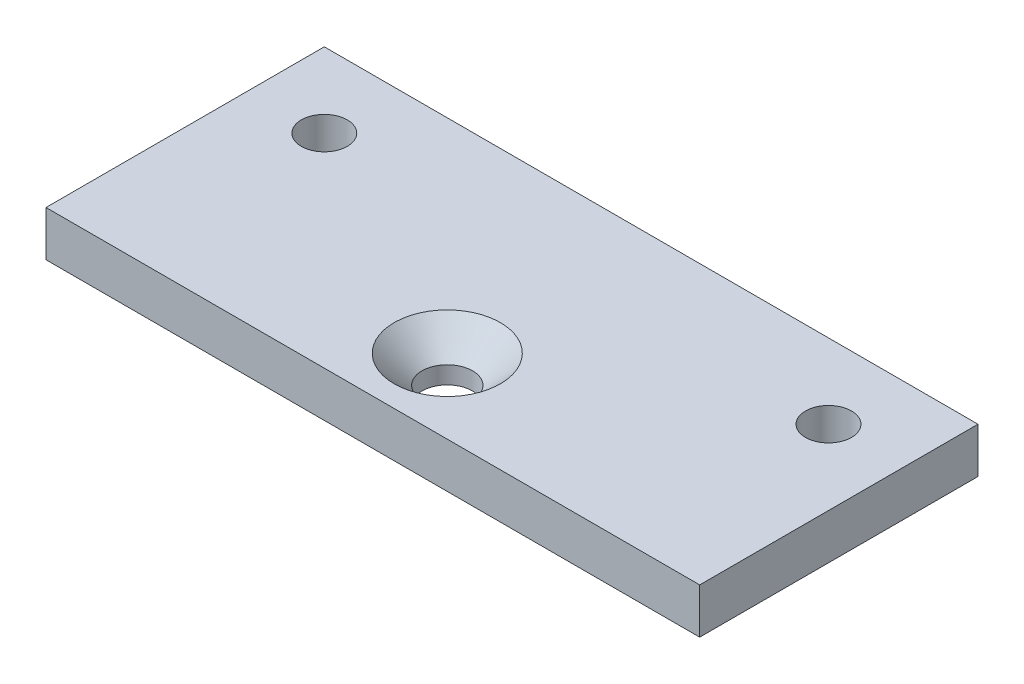
ISO-10303-21;
HEADER;
FILE_DESCRIPTION(('STEP AP214'),'2;1');
FILE_NAME('part.step','',(''),(''),'','','');
FILE_SCHEMA(('AUTOMOTIVE_DESIGN { 1 0 10303 214 1 1 1 1 }'));
ENDSEC;
DATA;
#1=APPLICATION_CONTEXT('core data for automotive mechanical design processes');
#2=APPLICATION_PROTOCOL_DEFINITION('international standard','automotive_design',2000,#1);
#3=PRODUCT_CONTEXT('',#1,'mechanical');
#4=PRODUCT('Part','Part','',(#3));
#5=PRODUCT_RELATED_PRODUCT_CATEGORY('part','',(#4));
#6=PRODUCT_DEFINITION_FORMATION('','',#4);
#7=PRODUCT_DEFINITION_CONTEXT('part definition',#1,'design');
#8=PRODUCT_DEFINITION('design','',#6,#7);
#9=PRODUCT_DEFINITION_SHAPE('','',#8);
#10=(LENGTH_UNIT() NAMED_UNIT(*) SI_UNIT(.MILLI.,.METRE.));
#11=(NAMED_UNIT(*) PLANE_ANGLE_UNIT() SI_UNIT($,.RADIAN.));
#12=(NAMED_UNIT(*) SI_UNIT($,.STERADIAN.) SOLID_ANGLE_UNIT());
#13=UNCERTAINTY_MEASURE_WITH_UNIT(LENGTH_MEASURE(1.E-05),#10,'distance_accuracy_value','');
#14=(GEOMETRIC_REPRESENTATION_CONTEXT(3) GLOBAL_UNCERTAINTY_ASSIGNED_CONTEXT((#13)) GLOBAL_UNIT_ASSIGNED_CONTEXT((#10,
#11,#12)) REPRESENTATION_CONTEXT('',''));
#15=CARTESIAN_POINT('',(0.,0.,0.));
#16=DIRECTION('',(0.,0.,1.));
#17=DIRECTION('',(1.,0.,0.));
#18=AXIS2_PLACEMENT_3D('',#15,#16,#17);
#19=CARTESIAN_POINT('',(0.,0.,-4.25));
#20=DIRECTION('',(0.,0.,1.));
#21=DIRECTION('',(1.,0.,0.));
#22=AXIS2_PLACEMENT_3D('',#19,#20,#21);
#23=PLANE('',#22);
#24=DIRECTION('',(1.,0.,0.));
#25=VECTOR('',#24,1.);
#26=CARTESIAN_POINT('',(0.,3.5,-4.25));
#27=LINE('',#26,#25);
#28=CARTESIAN_POINT('',(-25.25,3.5,-4.25));
#29=VERTEX_POINT('',#28);
#30=CARTESIAN_POINT('',(25.25,3.5,-4.25));
#31=VERTEX_POINT('',#30);
#32=EDGE_CURVE('E71',#29,#31,#27,.T.);
#33=ORIENTED_EDGE('',*,*,#32,.F.);
#34=DIRECTION('',(0.,1.,0.));
#35=VECTOR('',#34,1.);
#36=CARTESIAN_POINT('',(-25.25,3.5,-4.25));
#37=LINE('',#36,#35);
#38=CARTESIAN_POINT('',(-25.25,0.,-4.25));
#39=VERTEX_POINT('',#38);
#40=EDGE_CURVE('E82',#39,#29,#37,.T.);
#41=ORIENTED_EDGE('',*,*,#40,.F.);
#42=DIRECTION('',(1.,0.,0.));
#43=VECTOR('',#42,1.);
#44=CARTESIAN_POINT('',(0.,0.,-4.25));
#45=LINE('',#44,#43);
#46=CARTESIAN_POINT('',(25.25,0.,-4.25));
#47=VERTEX_POINT('',#46);
#48=EDGE_CURVE('E92',#39,#47,#45,.T.);
#49=ORIENTED_EDGE('',*,*,#48,.T.);
#50=DIRECTION('',(0.,1.,0.));
#51=VECTOR('',#50,1.);
#52=CARTESIAN_POINT('',(25.25,3.5,-4.25));
#53=LINE('',#52,#51);
#54=EDGE_CURVE('E93',#47,#31,#53,.T.);
#55=ORIENTED_EDGE('',*,*,#54,.T.);
#56=EDGE_LOOP('',(#33,#41,#49,#55));
#57=FACE_BOUND('',#56,.T.);
#58=ADVANCED_FACE('F34',(#57),#23,.T.);
#59=CARTESIAN_POINT('',(25.25,3.5,0.));
#60=DIRECTION('',(-1.,0.,0.));
#61=DIRECTION('',(0.,0.,1.));
#62=AXIS2_PLACEMENT_3D('',#59,#60,#61);
#63=PLANE('',#62);
#64=ORIENTED_EDGE('',*,*,#54,.F.);
#65=DIRECTION('',(0.,0.,-1.));
#66=VECTOR('',#65,1.);
#67=CARTESIAN_POINT('',(25.25,0.,0.));
#68=LINE('',#67,#66);
#69=CARTESIAN_POINT('',(25.25,0.,-25.75));
#70=VERTEX_POINT('',#69);
#71=EDGE_CURVE('E38',#47,#70,#68,.T.);
#72=ORIENTED_EDGE('',*,*,#71,.T.);
#73=DIRECTION('',(0.,-1.,0.));
#74=VECTOR('',#73,1.);
#75=CARTESIAN_POINT('',(25.25,3.5,-25.75));
#76=LINE('',#75,#74);
#77=CARTESIAN_POINT('',(25.25,3.5,-25.75));
#78=VERTEX_POINT('',#77);
#79=EDGE_CURVE('E121',#78,#70,#76,.T.);
#80=ORIENTED_EDGE('',*,*,#79,.F.);
#81=DIRECTION('',(0.,0.,-1.));
#82=VECTOR('',#81,1.);
#83=CARTESIAN_POINT('',(25.25,3.5,0.));
#84=LINE('',#83,#82);
#85=EDGE_CURVE('E101',#31,#78,#84,.T.);
#86=ORIENTED_EDGE('',*,*,#85,.F.);
#87=EDGE_LOOP('',(#64,#72,#80,#86));
#88=FACE_BOUND('',#87,.T.);
#89=ADVANCED_FACE('F150',(#88),#63,.F.);
#90=CARTESIAN_POINT('',(-25.25,3.5,0.));
#91=DIRECTION('',(-1.,0.,0.));
#92=DIRECTION('',(0.,0.,1.));
#93=AXIS2_PLACEMENT_3D('',#90,#91,#92);
#94=PLANE('',#93);
#95=DIRECTION('',(0.,0.,-1.));
#96=VECTOR('',#95,1.);
#97=CARTESIAN_POINT('',(-25.25,0.,0.));
#98=LINE('',#97,#96);
#99=CARTESIAN_POINT('',(-25.25,0.,-25.75));
#100=VERTEX_POINT('',#99);
#101=EDGE_CURVE('E79',#39,#100,#98,.T.);
#102=ORIENTED_EDGE('',*,*,#101,.F.);
#103=ORIENTED_EDGE('',*,*,#40,.T.);
#104=DIRECTION('',(0.,0.,-1.));
#105=VECTOR('',#104,1.);
#106=CARTESIAN_POINT('',(-25.25,3.5,0.));
#107=LINE('',#106,#105);
#108=CARTESIAN_POINT('',(-25.25,3.5,-25.75));
#109=VERTEX_POINT('',#108);
#110=EDGE_CURVE('E64',#29,#109,#107,.T.);
#111=ORIENTED_EDGE('',*,*,#110,.T.);
#112=DIRECTION('',(0.,-1.,0.));
#113=VECTOR('',#112,1.);
#114=CARTESIAN_POINT('',(-25.25,3.5,-25.75));
#115=LINE('',#114,#113);
#116=EDGE_CURVE('E83',#109,#100,#115,.T.);
#117=ORIENTED_EDGE('',*,*,#116,.T.);
#118=EDGE_LOOP('',(#102,#103,#111,#117));
#119=FACE_BOUND('',#118,.T.);
#120=ADVANCED_FACE('F81',(#119),#94,.T.);
#121=CARTESIAN_POINT('',(0.,3.5,0.));
#122=DIRECTION('',(0.,1.,0.));
#123=DIRECTION('',(0.,0.,1.));
#124=AXIS2_PLACEMENT_3D('',#121,#122,#123);
#125=PLANE('',#124);
#126=CARTESIAN_POINT('',(19.475,3.5,-19.975));
#127=DIRECTION('',(0.,1.,0.));
#128=DIRECTION('',(0.,0.,1.));
#129=AXIS2_PLACEMENT_3D('',#126,#127,#128);
#130=CIRCLE('',#129,1.775);
#131=CARTESIAN_POINT('',(19.475,3.5,-18.2));
#132=VERTEX_POINT('',#131);
#133=EDGE_CURVE('E102',#132,#132,#130,.T.);
#134=ORIENTED_EDGE('',*,*,#133,.F.);
#135=EDGE_LOOP('',(#134));
#136=FACE_BOUND('',#135,.T.);
#137=CARTESIAN_POINT('',(-19.475,3.5,-19.975));
#138=DIRECTION('',(0.,1.,0.));
#139=DIRECTION('',(0.,0.,1.));
#140=AXIS2_PLACEMENT_3D('',#137,#138,#139);
#141=CIRCLE('',#140,1.775);
#142=CARTESIAN_POINT('',(-19.475,3.5,-18.2));
#143=VERTEX_POINT('',#142);
#144=EDGE_CURVE('E89',#143,#143,#141,.T.);
#145=ORIENTED_EDGE('',*,*,#144,.F.);
#146=EDGE_LOOP('',(#145));
#147=FACE_BOUND('',#146,.T.);
#148=CARTESIAN_POINT('',(0.,3.5,-10.));
#149=DIRECTION('',(0.,1.,0.));
#150=DIRECTION('',(0.,0.,1.));
#151=AXIS2_PLACEMENT_3D('',#148,#149,#150);
#152=CIRCLE('',#151,4.1);
#153=CARTESIAN_POINT('',(0.,3.5,-5.9));
#154=VERTEX_POINT('',#153);
#155=EDGE_CURVE('E11',#154,#154,#152,.T.);
#156=ORIENTED_EDGE('',*,*,#155,.F.);
#157=EDGE_LOOP('',(#156));
#158=FACE_BOUND('',#157,.T.);
#159=ORIENTED_EDGE('',*,*,#110,.F.);
#160=ORIENTED_EDGE('',*,*,#32,.T.);
#161=ORIENTED_EDGE('',*,*,#85,.T.);
#162=DIRECTION('',(1.,0.,0.));
#163=VECTOR('',#162,1.);
#164=CARTESIAN_POINT('',(0.,3.5,-25.75));
#165=LINE('',#164,#163);
#166=EDGE_CURVE('E100',#109,#78,#165,.T.);
#167=ORIENTED_EDGE('',*,*,#166,.F.);
#168=EDGE_LOOP('',(#159,#160,#161,#167));
#169=FACE_BOUND('',#168,.T.);
#170=ADVANCED_FACE('F36',(#136,#147,#158,#169),#125,.T.);
#171=CARTESIAN_POINT('',(0.,0.,0.));
#172=DIRECTION('',(0.,1.,0.));
#173=DIRECTION('',(0.,0.,1.));
#174=AXIS2_PLACEMENT_3D('',#171,#172,#173);
#175=PLANE('',#174);
#176=CARTESIAN_POINT('',(19.475,0.,-19.975));
#177=DIRECTION('',(0.,1.,0.));
#178=DIRECTION('',(0.,0.,1.));
#179=AXIS2_PLACEMENT_3D('',#176,#177,#178);
#180=CIRCLE('',#179,1.775);
#181=CARTESIAN_POINT('',(19.475,0.,-18.2));
#182=VERTEX_POINT('',#181);
#183=EDGE_CURVE('E125',#182,#182,#180,.T.);
#184=ORIENTED_EDGE('',*,*,#183,.T.);
#185=EDGE_LOOP('',(#184));
#186=FACE_BOUND('',#185,.T.);
#187=CARTESIAN_POINT('',(-19.475,0.,-19.975));
#188=DIRECTION('',(0.,1.,0.));
#189=DIRECTION('',(0.,0.,1.));
#190=AXIS2_PLACEMENT_3D('',#187,#188,#189);
#191=CIRCLE('',#190,1.775);
#192=CARTESIAN_POINT('',(-19.475,0.,-18.2));
#193=VERTEX_POINT('',#192);
#194=EDGE_CURVE('E111',#193,#193,#191,.T.);
#195=ORIENTED_EDGE('',*,*,#194,.T.);
#196=EDGE_LOOP('',(#195));
#197=FACE_BOUND('',#196,.T.);
#198=CARTESIAN_POINT('',(0.,0.,-10.));
#199=DIRECTION('',(0.,1.,0.));
#200=DIRECTION('',(0.,0.,1.));
#201=AXIS2_PLACEMENT_3D('',#198,#199,#200);
#202=CIRCLE('',#201,1.95);
#203=CARTESIAN_POINT('',(0.,0.,-8.05));
#204=VERTEX_POINT('',#203);
#205=EDGE_CURVE('E116',#204,#204,#202,.T.);
#206=ORIENTED_EDGE('',*,*,#205,.T.);
#207=EDGE_LOOP('',(#206));
#208=FACE_BOUND('',#207,.T.);
#209=ORIENTED_EDGE('',*,*,#48,.F.);
#210=ORIENTED_EDGE('',*,*,#101,.T.);
#211=DIRECTION('',(1.,0.,0.));
#212=VECTOR('',#211,1.);
#213=CARTESIAN_POINT('',(0.,0.,-25.75));
#214=LINE('',#213,#212);
#215=EDGE_CURVE('E88',#100,#70,#214,.T.);
#216=ORIENTED_EDGE('',*,*,#215,.T.);
#217=ORIENTED_EDGE('',*,*,#71,.F.);
#218=EDGE_LOOP('',(#209,#210,#216,#217));
#219=FACE_BOUND('',#218,.T.);
#220=ADVANCED_FACE('F95',(#186,#197,#208,#219),#175,.F.);
#221=CARTESIAN_POINT('',(0.,3.5,-25.75));
#222=DIRECTION('',(0.,0.,-1.));
#223=DIRECTION('',(-1.,0.,0.));
#224=AXIS2_PLACEMENT_3D('',#221,#222,#223);
#225=PLANE('',#224);
#226=ORIENTED_EDGE('',*,*,#215,.F.);
#227=ORIENTED_EDGE('',*,*,#116,.F.);
#228=ORIENTED_EDGE('',*,*,#166,.T.);
#229=ORIENTED_EDGE('',*,*,#79,.T.);
#230=EDGE_LOOP('',(#226,#227,#228,#229));
#231=FACE_BOUND('',#230,.T.);
#232=ADVANCED_FACE('F147',(#231),#225,.T.);
#233=CARTESIAN_POINT('',(19.475,3.5,-19.975));
#234=DIRECTION('',(0.,-1.,0.));
#235=DIRECTION('',(0.,0.,-1.));
#236=AXIS2_PLACEMENT_3D('',#233,#234,#235);
#237=CYLINDRICAL_SURFACE('',#236,1.775);
#238=ORIENTED_EDGE('',*,*,#133,.T.);
#239=EDGE_LOOP('',(#238));
#240=FACE_BOUND('',#239,.T.);
#241=ORIENTED_EDGE('',*,*,#183,.F.);
#242=EDGE_LOOP('',(#241));
#243=FACE_BOUND('',#242,.T.);
#244=ADVANCED_FACE('F137',(#240,#243),#237,.F.);
#245=CARTESIAN_POINT('',(-19.475,3.5,-19.975));
#246=DIRECTION('',(0.,-1.,0.));
#247=DIRECTION('',(0.,0.,-1.));
#248=AXIS2_PLACEMENT_3D('',#245,#246,#247);
#249=CYLINDRICAL_SURFACE('',#248,1.775);
#250=ORIENTED_EDGE('',*,*,#144,.T.);
#251=EDGE_LOOP('',(#250));
#252=FACE_BOUND('',#251,.T.);
#253=ORIENTED_EDGE('',*,*,#194,.F.);
#254=EDGE_LOOP('',(#253));
#255=FACE_BOUND('',#254,.T.);
#256=ADVANCED_FACE('F134',(#252,#255),#249,.F.);
#257=CARTESIAN_POINT('',(0.,3.5,-10.));
#258=DIRECTION('',(0.,1.,0.));
#259=DIRECTION('',(0.,0.,1.));
#260=AXIS2_PLACEMENT_3D('',#257,#258,#259);
#261=CYLINDRICAL_SURFACE('',#260,1.95);
#262=ORIENTED_EDGE('',*,*,#205,.F.);
#263=EDGE_LOOP('',(#262));
#264=FACE_BOUND('',#263,.T.);
#265=CARTESIAN_POINT('',(0.,1.35,-10.));
#266=DIRECTION('',(0.,1.,0.));
#267=DIRECTION('',(0.,0.,1.));
#268=AXIS2_PLACEMENT_3D('',#265,#266,#267);
#269=CIRCLE('',#268,1.95);
#270=CARTESIAN_POINT('',(0.,1.35,-8.05));
#271=VERTEX_POINT('',#270);
#272=EDGE_CURVE('E44',#271,#271,#269,.T.);
#273=ORIENTED_EDGE('',*,*,#272,.T.);
#274=EDGE_LOOP('',(#273));
#275=FACE_BOUND('',#274,.T.);
#276=ADVANCED_FACE('F136',(#264,#275),#261,.F.);
#277=CARTESIAN_POINT('',(0.,3.5,-10.));
#278=DIRECTION('',(0.,1.,0.));
#279=DIRECTION('',(0.,0.,1.));
#280=AXIS2_PLACEMENT_3D('',#277,#278,#279);
#281=CONICAL_SURFACE('',#280,4.1,0.785398163397448);
#282=ORIENTED_EDGE('',*,*,#272,.F.);
#283=EDGE_LOOP('',(#282));
#284=FACE_BOUND('',#283,.T.);
#285=ORIENTED_EDGE('',*,*,#155,.T.);
#286=EDGE_LOOP('',(#285));
#287=FACE_BOUND('',#286,.T.);
#288=ADVANCED_FACE('F144',(#284,#287),#281,.F.);
#289=CLOSED_SHELL('',(#58,#89,#120,#170,#220,#232,#244,#256,#276,#288));
#290=MANIFOLD_SOLID_BREP('B2',#289);
#291=ADVANCED_BREP_SHAPE_REPRESENTATION('',(#18,#290),#14);
#292=SHAPE_DEFINITION_REPRESENTATION(#9,#291);
ENDSEC;
END-ISO-10303-21;
